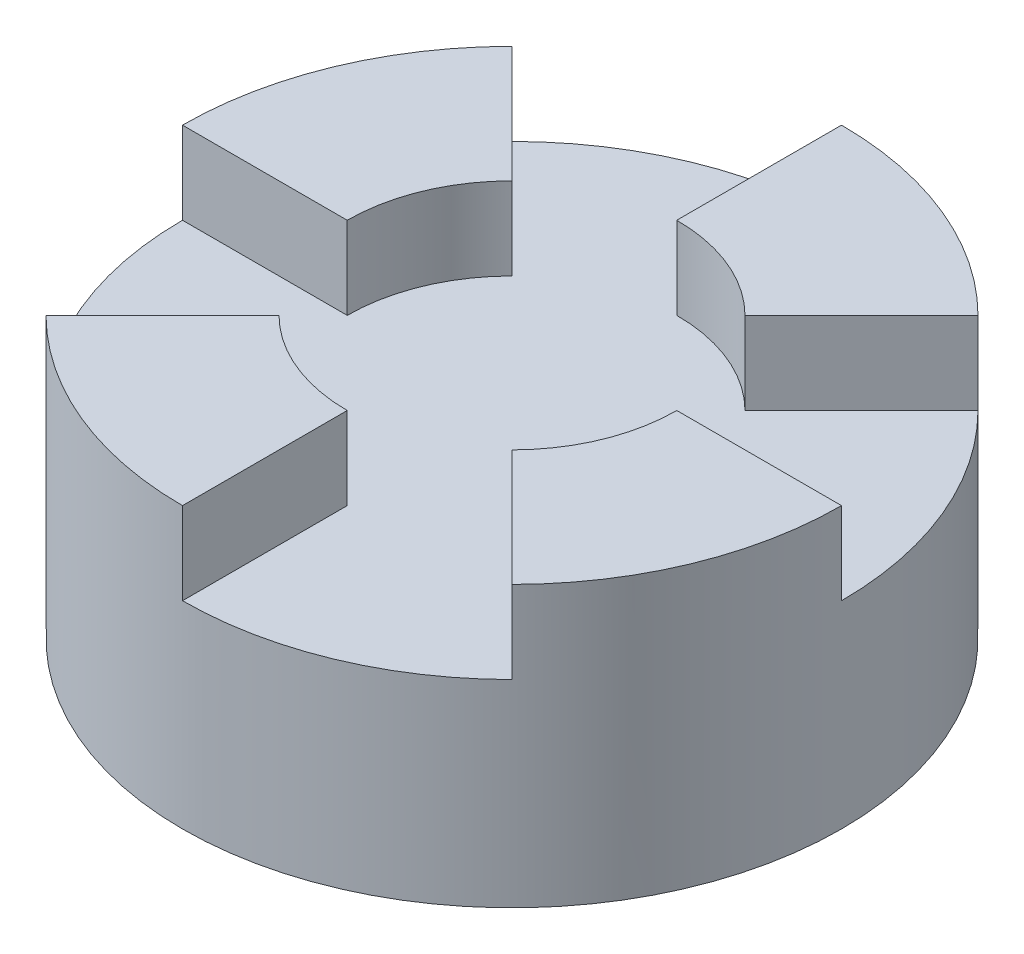
ISO-10303-21;
HEADER;
FILE_DESCRIPTION(('STEP AP214'),'2;1');
FILE_NAME('part.step','',(''),(''),'','','');
FILE_SCHEMA(('AUTOMOTIVE_DESIGN { 1 0 10303 214 1 1 1 1 }'));
ENDSEC;
DATA;
#1=APPLICATION_CONTEXT('core data for automotive mechanical design processes');
#2=APPLICATION_PROTOCOL_DEFINITION('international standard','automotive_design',2000,#1);
#3=PRODUCT_CONTEXT('',#1,'mechanical');
#4=PRODUCT('Part','Part','',(#3));
#5=PRODUCT_RELATED_PRODUCT_CATEGORY('part','',(#4));
#6=PRODUCT_DEFINITION_FORMATION('','',#4);
#7=PRODUCT_DEFINITION_CONTEXT('part definition',#1,'design');
#8=PRODUCT_DEFINITION('design','',#6,#7);
#9=PRODUCT_DEFINITION_SHAPE('','',#8);
#10=(LENGTH_UNIT() NAMED_UNIT(*) SI_UNIT(.MILLI.,.METRE.));
#11=(NAMED_UNIT(*) PLANE_ANGLE_UNIT() SI_UNIT($,.RADIAN.));
#12=(NAMED_UNIT(*) SI_UNIT($,.STERADIAN.) SOLID_ANGLE_UNIT());
#13=UNCERTAINTY_MEASURE_WITH_UNIT(LENGTH_MEASURE(1.E-05),#10,'distance_accuracy_value','');
#14=(GEOMETRIC_REPRESENTATION_CONTEXT(3) GLOBAL_UNCERTAINTY_ASSIGNED_CONTEXT((#13)) GLOBAL_UNIT_ASSIGNED_CONTEXT((#10,
#11,#12)) REPRESENTATION_CONTEXT('',''));
#15=CARTESIAN_POINT('',(0.,0.,0.));
#16=DIRECTION('',(0.,0.,1.));
#17=DIRECTION('',(1.,0.,0.));
#18=AXIS2_PLACEMENT_3D('',#15,#16,#17);
#19=CARTESIAN_POINT('',(0.,17.,0.));
#20=DIRECTION('',(0.,-1.,0.));
#21=DIRECTION('',(0.,0.,-1.));
#22=AXIS2_PLACEMENT_3D('',#19,#20,#21);
#23=CYLINDRICAL_SURFACE('',#22,20.);
#24=CARTESIAN_POINT('',(0.,0.,0.));
#25=DIRECTION('',(0.,1.,0.));
#26=DIRECTION('',(0.,0.,1.));
#27=AXIS2_PLACEMENT_3D('',#24,#25,#26);
#28=CIRCLE('',#27,20.);
#29=CARTESIAN_POINT('',(0.,0.,20.));
#30=VERTEX_POINT('',#29);
#31=EDGE_CURVE('E36',#30,#30,#28,.T.);
#32=ORIENTED_EDGE('',*,*,#31,.T.);
#33=EDGE_LOOP('',(#32));
#34=FACE_BOUND('',#33,.T.);
#35=DIRECTION('',(0.,1.,0.));
#36=VECTOR('',#35,1.);
#37=CARTESIAN_POINT('',(14.142135623731,12.,14.1421356237309));
#38=LINE('',#37,#36);
#39=CARTESIAN_POINT('',(14.142135623731,12.,14.1421356237309));
#40=VERTEX_POINT('',#39);
#41=CARTESIAN_POINT('',(14.142135623731,17.,14.1421356237309));
#42=VERTEX_POINT('',#41);
#43=EDGE_CURVE('E220',#40,#42,#38,.T.);
#44=ORIENTED_EDGE('',*,*,#43,.F.);
#45=CARTESIAN_POINT('',(0.,12.,0.));
#46=DIRECTION('',(0.,1.,0.));
#47=DIRECTION('',(0.,0.,1.));
#48=AXIS2_PLACEMENT_3D('',#45,#46,#47);
#49=CIRCLE('',#48,20.);
#50=CARTESIAN_POINT('',(0.,12.,20.));
#51=VERTEX_POINT('',#50);
#52=EDGE_CURVE('E432',#51,#40,#49,.T.);
#53=ORIENTED_EDGE('',*,*,#52,.F.);
#54=DIRECTION('',(0.,1.,0.));
#55=VECTOR('',#54,1.);
#56=CARTESIAN_POINT('',(0.,12.,20.));
#57=LINE('',#56,#55);
#58=CARTESIAN_POINT('',(0.,17.,20.));
#59=VERTEX_POINT('',#58);
#60=EDGE_CURVE('E222',#51,#59,#57,.T.);
#61=ORIENTED_EDGE('',*,*,#60,.T.);
#62=CARTESIAN_POINT('',(0.,17.,0.));
#63=DIRECTION('',(0.,1.,0.));
#64=DIRECTION('',(0.,0.,1.));
#65=AXIS2_PLACEMENT_3D('',#62,#63,#64);
#66=CIRCLE('',#65,20.);
#67=CARTESIAN_POINT('',(-14.1421356237309,17.,14.142135623731));
#68=VERTEX_POINT('',#67);
#69=EDGE_CURVE('E42',#68,#59,#66,.T.);
#70=ORIENTED_EDGE('',*,*,#69,.F.);
#71=DIRECTION('',(0.,1.,0.));
#72=VECTOR('',#71,1.);
#73=CARTESIAN_POINT('',(-14.1421356237309,12.,14.142135623731));
#74=LINE('',#73,#72);
#75=CARTESIAN_POINT('',(-14.1421356237309,12.,14.142135623731));
#76=VERTEX_POINT('',#75);
#77=EDGE_CURVE('E229',#76,#68,#74,.T.);
#78=ORIENTED_EDGE('',*,*,#77,.F.);
#79=CARTESIAN_POINT('',(0.,12.,0.));
#80=DIRECTION('',(0.,1.,0.));
#81=DIRECTION('',(0.,0.,1.));
#82=AXIS2_PLACEMENT_3D('',#79,#80,#81);
#83=CIRCLE('',#82,20.);
#84=CARTESIAN_POINT('',(-20.,12.,0.));
#85=VERTEX_POINT('',#84);
#86=EDGE_CURVE('E421',#85,#76,#83,.T.);
#87=ORIENTED_EDGE('',*,*,#86,.F.);
#88=DIRECTION('',(0.,1.,0.));
#89=VECTOR('',#88,1.);
#90=CARTESIAN_POINT('',(-20.,12.,0.));
#91=LINE('',#90,#89);
#92=CARTESIAN_POINT('',(-20.,17.,0.));
#93=VERTEX_POINT('',#92);
#94=EDGE_CURVE('E231',#85,#93,#91,.T.);
#95=ORIENTED_EDGE('',*,*,#94,.T.);
#96=CARTESIAN_POINT('',(-14.142135623731,17.,-14.1421356237309));
#97=VERTEX_POINT('',#96);
#98=EDGE_CURVE('E244',#97,#93,#66,.T.);
#99=ORIENTED_EDGE('',*,*,#98,.F.);
#100=DIRECTION('',(0.,1.,0.));
#101=VECTOR('',#100,1.);
#102=CARTESIAN_POINT('',(-14.142135623731,12.,-14.1421356237309));
#103=LINE('',#102,#101);
#104=CARTESIAN_POINT('',(-14.142135623731,12.,-14.1421356237309));
#105=VERTEX_POINT('',#104);
#106=EDGE_CURVE('E238',#105,#97,#103,.T.);
#107=ORIENTED_EDGE('',*,*,#106,.F.);
#108=CARTESIAN_POINT('',(0.,12.,0.));
#109=DIRECTION('',(0.,1.,0.));
#110=DIRECTION('',(0.,0.,1.));
#111=AXIS2_PLACEMENT_3D('',#108,#109,#110);
#112=CIRCLE('',#111,20.);
#113=CARTESIAN_POINT('',(0.,12.,-20.));
#114=VERTEX_POINT('',#113);
#115=EDGE_CURVE('E407',#114,#105,#112,.T.);
#116=ORIENTED_EDGE('',*,*,#115,.F.);
#117=DIRECTION('',(0.,1.,0.));
#118=VECTOR('',#117,1.);
#119=CARTESIAN_POINT('',(0.,12.,-20.));
#120=LINE('',#119,#118);
#121=CARTESIAN_POINT('',(0.,17.,-20.));
#122=VERTEX_POINT('',#121);
#123=EDGE_CURVE('E240',#114,#122,#120,.T.);
#124=ORIENTED_EDGE('',*,*,#123,.T.);
#125=CARTESIAN_POINT('',(14.1421356237309,17.,-14.142135623731));
#126=VERTEX_POINT('',#125);
#127=EDGE_CURVE('E41',#126,#122,#66,.T.);
#128=ORIENTED_EDGE('',*,*,#127,.F.);
#129=DIRECTION('',(0.,1.,0.));
#130=VECTOR('',#129,1.);
#131=CARTESIAN_POINT('',(14.1421356237309,12.,-14.142135623731));
#132=LINE('',#131,#130);
#133=CARTESIAN_POINT('',(14.1421356237309,12.,-14.142135623731));
#134=VERTEX_POINT('',#133);
#135=EDGE_CURVE('E162',#134,#126,#132,.T.);
#136=ORIENTED_EDGE('',*,*,#135,.F.);
#137=CARTESIAN_POINT('',(0.,12.,0.));
#138=DIRECTION('',(0.,1.,0.));
#139=DIRECTION('',(0.,0.,1.));
#140=AXIS2_PLACEMENT_3D('',#137,#138,#139);
#141=CIRCLE('',#140,20.);
#142=CARTESIAN_POINT('',(20.,12.,0.));
#143=VERTEX_POINT('',#142);
#144=EDGE_CURVE('E169',#143,#134,#141,.T.);
#145=ORIENTED_EDGE('',*,*,#144,.F.);
#146=DIRECTION('',(0.,1.,0.));
#147=VECTOR('',#146,1.);
#148=CARTESIAN_POINT('',(20.,12.,0.));
#149=LINE('',#148,#147);
#150=CARTESIAN_POINT('',(20.,17.,0.));
#151=VERTEX_POINT('',#150);
#152=EDGE_CURVE('E152',#143,#151,#149,.T.);
#153=ORIENTED_EDGE('',*,*,#152,.T.);
#154=EDGE_CURVE('E11',#42,#151,#66,.T.);
#155=ORIENTED_EDGE('',*,*,#154,.F.);
#156=EDGE_LOOP('',(#44,#53,#61,#70,#78,#87,#95,#99,#107,#116,#124,#128,#136,#145,#153,#155));
#157=FACE_BOUND('',#156,.T.);
#158=ADVANCED_FACE('F33',(#34,#157),#23,.T.);
#159=CARTESIAN_POINT('',(0.,17.,0.));
#160=DIRECTION('',(0.,1.,0.));
#161=DIRECTION('',(0.,0.,1.));
#162=AXIS2_PLACEMENT_3D('',#159,#160,#161);
#163=PLANE('',#162);
#164=DIRECTION('',(1.,0.,0.));
#165=VECTOR('',#164,1.);
#166=CARTESIAN_POINT('',(0.,17.,0.));
#167=LINE('',#166,#165);
#168=CARTESIAN_POINT('',(10.,17.,0.));
#169=VERTEX_POINT('',#168);
#170=EDGE_CURVE('E158',#169,#151,#167,.T.);
#171=ORIENTED_EDGE('',*,*,#170,.F.);
#172=CARTESIAN_POINT('',(0.,17.,0.));
#173=DIRECTION('',(0.,1.,0.));
#174=DIRECTION('',(0.,0.,1.));
#175=AXIS2_PLACEMENT_3D('',#172,#173,#174);
#176=CIRCLE('',#175,10.);
#177=CARTESIAN_POINT('',(7.07106781186549,17.,7.07106781186546));
#178=VERTEX_POINT('',#177);
#179=EDGE_CURVE('E207',#178,#169,#176,.T.);
#180=ORIENTED_EDGE('',*,*,#179,.F.);
#181=DIRECTION('',(0.707106781186549,0.,0.707106781186546));
#182=VECTOR('',#181,1.);
#183=CARTESIAN_POINT('',(0.,17.,0.));
#184=LINE('',#183,#182);
#185=EDGE_CURVE('E204',#178,#42,#184,.T.);
#186=ORIENTED_EDGE('',*,*,#185,.T.);
#187=ORIENTED_EDGE('',*,*,#154,.T.);
#188=EDGE_LOOP('',(#171,#180,#186,#187));
#189=FACE_BOUND('',#188,.T.);
#190=ADVANCED_FACE('F265',(#189),#163,.T.);
#191=ORIENTED_EDGE('',*,*,#98,.T.);
#192=DIRECTION('',(1.,0.,0.));
#193=VECTOR('',#192,1.);
#194=CARTESIAN_POINT('',(0.,17.,0.));
#195=LINE('',#194,#193);
#196=CARTESIAN_POINT('',(-10.,17.,0.));
#197=VERTEX_POINT('',#196);
#198=EDGE_CURVE('E193',#93,#197,#195,.T.);
#199=ORIENTED_EDGE('',*,*,#198,.T.);
#200=CARTESIAN_POINT('',(0.,17.,0.));
#201=DIRECTION('',(0.,1.,0.));
#202=DIRECTION('',(0.,0.,1.));
#203=AXIS2_PLACEMENT_3D('',#200,#201,#202);
#204=CIRCLE('',#203,10.);
#205=CARTESIAN_POINT('',(-7.07106781186549,17.,-7.07106781186546));
#206=VERTEX_POINT('',#205);
#207=EDGE_CURVE('E190',#206,#197,#204,.T.);
#208=ORIENTED_EDGE('',*,*,#207,.F.);
#209=DIRECTION('',(-0.707106781186549,0.,-0.707106781186546));
#210=VECTOR('',#209,1.);
#211=CARTESIAN_POINT('',(0.,17.,0.));
#212=LINE('',#211,#210);
#213=EDGE_CURVE('E187',#206,#97,#212,.T.);
#214=ORIENTED_EDGE('',*,*,#213,.T.);
#215=EDGE_LOOP('',(#191,#199,#208,#214));
#216=FACE_BOUND('',#215,.T.);
#217=ADVANCED_FACE('F270',(#216),#163,.T.);
#218=CARTESIAN_POINT('',(0.,17.,0.));
#219=DIRECTION('',(0.,1.,0.));
#220=DIRECTION('',(0.,0.,1.));
#221=AXIS2_PLACEMENT_3D('',#218,#219,#220);
#222=CIRCLE('',#221,10.);
#223=CARTESIAN_POINT('',(7.07106781186546,17.,-7.07106781186549));
#224=VERTEX_POINT('',#223);
#225=CARTESIAN_POINT('',(0.,17.,-10.));
#226=VERTEX_POINT('',#225);
#227=EDGE_CURVE('E49',#224,#226,#222,.T.);
#228=ORIENTED_EDGE('',*,*,#227,.F.);
#229=DIRECTION('',(0.707106781186546,0.,-0.707106781186549));
#230=VECTOR('',#229,1.);
#231=CARTESIAN_POINT('',(0.,17.,0.));
#232=LINE('',#231,#230);
#233=EDGE_CURVE('E211',#224,#126,#232,.T.);
#234=ORIENTED_EDGE('',*,*,#233,.T.);
#235=ORIENTED_EDGE('',*,*,#127,.T.);
#236=DIRECTION('',(0.,0.,1.));
#237=VECTOR('',#236,1.);
#238=CARTESIAN_POINT('',(0.,17.,0.));
#239=LINE('',#238,#237);
#240=EDGE_CURVE('E184',#122,#226,#239,.T.);
#241=ORIENTED_EDGE('',*,*,#240,.T.);
#242=EDGE_LOOP('',(#228,#234,#235,#241));
#243=FACE_BOUND('',#242,.T.);
#244=ADVANCED_FACE('F263',(#243),#163,.T.);
#245=DIRECTION('',(0.,0.,1.));
#246=VECTOR('',#245,1.);
#247=CARTESIAN_POINT('',(0.,17.,0.));
#248=LINE('',#247,#246);
#249=CARTESIAN_POINT('',(0.,17.,10.));
#250=VERTEX_POINT('',#249);
#251=EDGE_CURVE('E202',#250,#59,#248,.T.);
#252=ORIENTED_EDGE('',*,*,#251,.F.);
#253=CARTESIAN_POINT('',(0.,17.,0.));
#254=DIRECTION('',(0.,1.,0.));
#255=DIRECTION('',(0.,0.,1.));
#256=AXIS2_PLACEMENT_3D('',#253,#254,#255);
#257=CIRCLE('',#256,10.);
#258=CARTESIAN_POINT('',(-7.07106781186546,17.,7.07106781186549));
#259=VERTEX_POINT('',#258);
#260=EDGE_CURVE('E199',#259,#250,#257,.T.);
#261=ORIENTED_EDGE('',*,*,#260,.F.);
#262=DIRECTION('',(-0.707106781186546,0.,0.707106781186549));
#263=VECTOR('',#262,1.);
#264=CARTESIAN_POINT('',(0.,17.,0.));
#265=LINE('',#264,#263);
#266=EDGE_CURVE('E196',#259,#68,#265,.T.);
#267=ORIENTED_EDGE('',*,*,#266,.T.);
#268=ORIENTED_EDGE('',*,*,#69,.T.);
#269=EDGE_LOOP('',(#252,#261,#267,#268));
#270=FACE_BOUND('',#269,.T.);
#271=ADVANCED_FACE('F256',(#270),#163,.T.);
#272=CARTESIAN_POINT('',(0.,0.,0.));
#273=DIRECTION('',(0.,1.,0.));
#274=DIRECTION('',(0.,0.,1.));
#275=AXIS2_PLACEMENT_3D('',#272,#273,#274);
#276=PLANE('',#275);
#277=ORIENTED_EDGE('',*,*,#31,.F.);
#278=EDGE_LOOP('',(#277));
#279=FACE_BOUND('',#278,.T.);
#280=ADVANCED_FACE('F253',(#279),#276,.F.);
#281=CARTESIAN_POINT('',(0.,12.,0.));
#282=DIRECTION('',(0.,1.,0.));
#283=DIRECTION('',(0.,0.,1.));
#284=AXIS2_PLACEMENT_3D('',#281,#282,#283);
#285=CYLINDRICAL_SURFACE('',#284,10.);
#286=ORIENTED_EDGE('',*,*,#227,.T.);
#287=DIRECTION('',(0.,1.,0.));
#288=VECTOR('',#287,1.);
#289=CARTESIAN_POINT('',(0.,12.,-10.));
#290=LINE('',#289,#288);
#291=CARTESIAN_POINT('',(0.,12.,-10.));
#292=VERTEX_POINT('',#291);
#293=EDGE_CURVE('E179',#292,#226,#290,.T.);
#294=ORIENTED_EDGE('',*,*,#293,.F.);
#295=CARTESIAN_POINT('',(0.,12.,0.));
#296=DIRECTION('',(0.,1.,0.));
#297=DIRECTION('',(0.,0.,1.));
#298=AXIS2_PLACEMENT_3D('',#295,#296,#297);
#299=CIRCLE('',#298,10.);
#300=CARTESIAN_POINT('',(7.07106781186546,12.,-7.07106781186549));
#301=VERTEX_POINT('',#300);
#302=EDGE_CURVE('E214',#301,#292,#299,.T.);
#303=ORIENTED_EDGE('',*,*,#302,.F.);
#304=DIRECTION('',(0.,1.,0.));
#305=VECTOR('',#304,1.);
#306=CARTESIAN_POINT('',(7.07106781186546,12.,-7.07106781186549));
#307=LINE('',#306,#305);
#308=EDGE_CURVE('E57',#301,#224,#307,.T.);
#309=ORIENTED_EDGE('',*,*,#308,.T.);
#310=EDGE_LOOP('',(#286,#294,#303,#309));
#311=FACE_BOUND('',#310,.T.);
#312=ADVANCED_FACE('F255',(#311),#285,.F.);
#313=CARTESIAN_POINT('',(0.,12.,0.));
#314=DIRECTION('',(0.707106781186549,0.,0.707106781186546));
#315=DIRECTION('',(0.707106781186546,0.,-0.707106781186549));
#316=AXIS2_PLACEMENT_3D('',#313,#314,#315);
#317=PLANE('',#316);
#318=ORIENTED_EDGE('',*,*,#233,.F.);
#319=ORIENTED_EDGE('',*,*,#308,.F.);
#320=DIRECTION('',(0.707106781186546,0.,-0.707106781186549));
#321=VECTOR('',#320,1.);
#322=CARTESIAN_POINT('',(0.,12.,0.));
#323=LINE('',#322,#321);
#324=EDGE_CURVE('E177',#301,#134,#323,.T.);
#325=ORIENTED_EDGE('',*,*,#324,.T.);
#326=ORIENTED_EDGE('',*,*,#135,.T.);
#327=EDGE_LOOP('',(#318,#319,#325,#326));
#328=FACE_BOUND('',#327,.T.);
#329=ADVANCED_FACE('F261',(#328),#317,.T.);
#330=CARTESIAN_POINT('',(0.,12.,0.));
#331=DIRECTION('',(0.,0.,1.));
#332=DIRECTION('',(1.,0.,0.));
#333=AXIS2_PLACEMENT_3D('',#330,#331,#332);
#334=PLANE('',#333);
#335=ORIENTED_EDGE('',*,*,#170,.T.);
#336=ORIENTED_EDGE('',*,*,#152,.F.);
#337=DIRECTION('',(1.,0.,0.));
#338=VECTOR('',#337,1.);
#339=CARTESIAN_POINT('',(0.,12.,0.));
#340=LINE('',#339,#338);
#341=CARTESIAN_POINT('',(10.,12.,0.));
#342=VERTEX_POINT('',#341);
#343=EDGE_CURVE('E155',#342,#143,#340,.T.);
#344=ORIENTED_EDGE('',*,*,#343,.F.);
#345=DIRECTION('',(0.,1.,0.));
#346=VECTOR('',#345,1.);
#347=CARTESIAN_POINT('',(10.,12.,0.));
#348=LINE('',#347,#346);
#349=EDGE_CURVE('E163',#342,#169,#348,.T.);
#350=ORIENTED_EDGE('',*,*,#349,.T.);
#351=EDGE_LOOP('',(#335,#336,#344,#350));
#352=FACE_BOUND('',#351,.T.);
#353=ADVANCED_FACE('F154',(#352),#334,.F.);
#354=CARTESIAN_POINT('',(0.,12.,0.));
#355=DIRECTION('',(0.,1.,0.));
#356=DIRECTION('',(0.,0.,1.));
#357=AXIS2_PLACEMENT_3D('',#354,#355,#356);
#358=CYLINDRICAL_SURFACE('',#357,10.);
#359=ORIENTED_EDGE('',*,*,#179,.T.);
#360=ORIENTED_EDGE('',*,*,#349,.F.);
#361=CARTESIAN_POINT('',(0.,12.,0.));
#362=DIRECTION('',(0.,1.,0.));
#363=DIRECTION('',(0.,0.,1.));
#364=AXIS2_PLACEMENT_3D('',#361,#362,#363);
#365=CIRCLE('',#364,10.);
#366=CARTESIAN_POINT('',(7.07106781186549,12.,7.07106781186546));
#367=VERTEX_POINT('',#366);
#368=EDGE_CURVE('E173',#367,#342,#365,.T.);
#369=ORIENTED_EDGE('',*,*,#368,.F.);
#370=DIRECTION('',(0.,1.,0.));
#371=VECTOR('',#370,1.);
#372=CARTESIAN_POINT('',(7.07106781186549,12.,7.07106781186546));
#373=LINE('',#372,#371);
#374=EDGE_CURVE('E218',#367,#178,#373,.T.);
#375=ORIENTED_EDGE('',*,*,#374,.T.);
#376=EDGE_LOOP('',(#359,#360,#369,#375));
#377=FACE_BOUND('',#376,.T.);
#378=ADVANCED_FACE('F307',(#377),#358,.F.);
#379=CARTESIAN_POINT('',(0.,12.,0.));
#380=DIRECTION('',(-0.707106781186546,0.,0.707106781186549));
#381=DIRECTION('',(0.707106781186549,0.,0.707106781186546));
#382=AXIS2_PLACEMENT_3D('',#379,#380,#381);
#383=PLANE('',#382);
#384=ORIENTED_EDGE('',*,*,#185,.F.);
#385=ORIENTED_EDGE('',*,*,#374,.F.);
#386=DIRECTION('',(0.707106781186549,0.,0.707106781186546));
#387=VECTOR('',#386,1.);
#388=CARTESIAN_POINT('',(0.,12.,0.));
#389=LINE('',#388,#387);
#390=EDGE_CURVE('E435',#367,#40,#389,.T.);
#391=ORIENTED_EDGE('',*,*,#390,.T.);
#392=ORIENTED_EDGE('',*,*,#43,.T.);
#393=EDGE_LOOP('',(#384,#385,#391,#392));
#394=FACE_BOUND('',#393,.T.);
#395=ADVANCED_FACE('F303',(#394),#383,.T.);
#396=CARTESIAN_POINT('',(0.,12.,0.));
#397=DIRECTION('',(-1.,0.,0.));
#398=DIRECTION('',(0.,0.,1.));
#399=AXIS2_PLACEMENT_3D('',#396,#397,#398);
#400=PLANE('',#399);
#401=ORIENTED_EDGE('',*,*,#251,.T.);
#402=ORIENTED_EDGE('',*,*,#60,.F.);
#403=DIRECTION('',(0.,0.,1.));
#404=VECTOR('',#403,1.);
#405=CARTESIAN_POINT('',(0.,12.,0.));
#406=LINE('',#405,#404);
#407=CARTESIAN_POINT('',(0.,12.,10.));
#408=VERTEX_POINT('',#407);
#409=EDGE_CURVE('E429',#408,#51,#406,.T.);
#410=ORIENTED_EDGE('',*,*,#409,.F.);
#411=DIRECTION('',(0.,1.,0.));
#412=VECTOR('',#411,1.);
#413=CARTESIAN_POINT('',(0.,12.,10.));
#414=LINE('',#413,#412);
#415=EDGE_CURVE('E225',#408,#250,#414,.T.);
#416=ORIENTED_EDGE('',*,*,#415,.T.);
#417=EDGE_LOOP('',(#401,#402,#410,#416));
#418=FACE_BOUND('',#417,.T.);
#419=ADVANCED_FACE('F299',(#418),#400,.F.);
#420=CARTESIAN_POINT('',(0.,12.,0.));
#421=DIRECTION('',(0.,1.,0.));
#422=DIRECTION('',(0.,0.,1.));
#423=AXIS2_PLACEMENT_3D('',#420,#421,#422);
#424=CYLINDRICAL_SURFACE('',#423,10.);
#425=ORIENTED_EDGE('',*,*,#260,.T.);
#426=ORIENTED_EDGE('',*,*,#415,.F.);
#427=CARTESIAN_POINT('',(0.,12.,0.));
#428=DIRECTION('',(0.,1.,0.));
#429=DIRECTION('',(0.,0.,1.));
#430=AXIS2_PLACEMENT_3D('',#427,#428,#429);
#431=CIRCLE('',#430,10.);
#432=CARTESIAN_POINT('',(-7.07106781186546,12.,7.07106781186549));
#433=VERTEX_POINT('',#432);
#434=EDGE_CURVE('E426',#433,#408,#431,.T.);
#435=ORIENTED_EDGE('',*,*,#434,.F.);
#436=DIRECTION('',(0.,1.,0.));
#437=VECTOR('',#436,1.);
#438=CARTESIAN_POINT('',(-7.07106781186546,12.,7.07106781186549));
#439=LINE('',#438,#437);
#440=EDGE_CURVE('E227',#433,#259,#439,.T.);
#441=ORIENTED_EDGE('',*,*,#440,.T.);
#442=EDGE_LOOP('',(#425,#426,#435,#441));
#443=FACE_BOUND('',#442,.T.);
#444=ADVANCED_FACE('F295',(#443),#424,.F.);
#445=CARTESIAN_POINT('',(0.,12.,0.));
#446=DIRECTION('',(-0.707106781186549,0.,-0.707106781186546));
#447=DIRECTION('',(-0.707106781186546,0.,0.707106781186549));
#448=AXIS2_PLACEMENT_3D('',#445,#446,#447);
#449=PLANE('',#448);
#450=ORIENTED_EDGE('',*,*,#266,.F.);
#451=ORIENTED_EDGE('',*,*,#440,.F.);
#452=DIRECTION('',(-0.707106781186546,0.,0.707106781186549));
#453=VECTOR('',#452,1.);
#454=CARTESIAN_POINT('',(0.,12.,0.));
#455=LINE('',#454,#453);
#456=EDGE_CURVE('E424',#433,#76,#455,.T.);
#457=ORIENTED_EDGE('',*,*,#456,.T.);
#458=ORIENTED_EDGE('',*,*,#77,.T.);
#459=EDGE_LOOP('',(#450,#451,#457,#458));
#460=FACE_BOUND('',#459,.T.);
#461=ADVANCED_FACE('F291',(#460),#449,.T.);
#462=CARTESIAN_POINT('',(0.,12.,0.));
#463=DIRECTION('',(0.,0.,1.));
#464=DIRECTION('',(1.,0.,0.));
#465=AXIS2_PLACEMENT_3D('',#462,#463,#464);
#466=PLANE('',#465);
#467=ORIENTED_EDGE('',*,*,#198,.F.);
#468=ORIENTED_EDGE('',*,*,#94,.F.);
#469=DIRECTION('',(1.,0.,0.));
#470=VECTOR('',#469,1.);
#471=CARTESIAN_POINT('',(0.,12.,0.));
#472=LINE('',#471,#470);
#473=CARTESIAN_POINT('',(-10.,12.,0.));
#474=VERTEX_POINT('',#473);
#475=EDGE_CURVE('E419',#85,#474,#472,.T.);
#476=ORIENTED_EDGE('',*,*,#475,.T.);
#477=DIRECTION('',(0.,1.,0.));
#478=VECTOR('',#477,1.);
#479=CARTESIAN_POINT('',(-10.,12.,0.));
#480=LINE('',#479,#478);
#481=EDGE_CURVE('E234',#474,#197,#480,.T.);
#482=ORIENTED_EDGE('',*,*,#481,.T.);
#483=EDGE_LOOP('',(#467,#468,#476,#482));
#484=FACE_BOUND('',#483,.T.);
#485=ADVANCED_FACE('F287',(#484),#466,.T.);
#486=CARTESIAN_POINT('',(0.,12.,0.));
#487=DIRECTION('',(0.,1.,0.));
#488=DIRECTION('',(0.,0.,1.));
#489=AXIS2_PLACEMENT_3D('',#486,#487,#488);
#490=CYLINDRICAL_SURFACE('',#489,10.);
#491=ORIENTED_EDGE('',*,*,#207,.T.);
#492=ORIENTED_EDGE('',*,*,#481,.F.);
#493=CARTESIAN_POINT('',(0.,12.,0.));
#494=DIRECTION('',(0.,1.,0.));
#495=DIRECTION('',(0.,0.,1.));
#496=AXIS2_PLACEMENT_3D('',#493,#494,#495);
#497=CIRCLE('',#496,10.);
#498=CARTESIAN_POINT('',(-7.07106781186549,12.,-7.07106781186546));
#499=VERTEX_POINT('',#498);
#500=EDGE_CURVE('E412',#499,#474,#497,.T.);
#501=ORIENTED_EDGE('',*,*,#500,.F.);
#502=DIRECTION('',(0.,1.,0.));
#503=VECTOR('',#502,1.);
#504=CARTESIAN_POINT('',(-7.07106781186549,12.,-7.07106781186546));
#505=LINE('',#504,#503);
#506=EDGE_CURVE('E236',#499,#206,#505,.T.);
#507=ORIENTED_EDGE('',*,*,#506,.T.);
#508=EDGE_LOOP('',(#491,#492,#501,#507));
#509=FACE_BOUND('',#508,.T.);
#510=ADVANCED_FACE('F283',(#509),#490,.F.);
#511=CARTESIAN_POINT('',(0.,12.,0.));
#512=DIRECTION('',(0.707106781186546,0.,-0.707106781186549));
#513=DIRECTION('',(-0.707106781186549,0.,-0.707106781186546));
#514=AXIS2_PLACEMENT_3D('',#511,#512,#513);
#515=PLANE('',#514);
#516=ORIENTED_EDGE('',*,*,#213,.F.);
#517=ORIENTED_EDGE('',*,*,#506,.F.);
#518=DIRECTION('',(-0.707106781186549,0.,-0.707106781186546));
#519=VECTOR('',#518,1.);
#520=CARTESIAN_POINT('',(0.,12.,0.));
#521=LINE('',#520,#519);
#522=EDGE_CURVE('E410',#499,#105,#521,.T.);
#523=ORIENTED_EDGE('',*,*,#522,.T.);
#524=ORIENTED_EDGE('',*,*,#106,.T.);
#525=EDGE_LOOP('',(#516,#517,#523,#524));
#526=FACE_BOUND('',#525,.T.);
#527=ADVANCED_FACE('F280',(#526),#515,.T.);
#528=CARTESIAN_POINT('',(0.,12.,0.));
#529=DIRECTION('',(-1.,0.,0.));
#530=DIRECTION('',(0.,0.,1.));
#531=AXIS2_PLACEMENT_3D('',#528,#529,#530);
#532=PLANE('',#531);
#533=ORIENTED_EDGE('',*,*,#240,.F.);
#534=ORIENTED_EDGE('',*,*,#123,.F.);
#535=DIRECTION('',(0.,0.,1.));
#536=VECTOR('',#535,1.);
#537=CARTESIAN_POINT('',(0.,12.,0.));
#538=LINE('',#537,#536);
#539=EDGE_CURVE('E113',#114,#292,#538,.T.);
#540=ORIENTED_EDGE('',*,*,#539,.T.);
#541=ORIENTED_EDGE('',*,*,#293,.T.);
#542=EDGE_LOOP('',(#533,#534,#540,#541));
#543=FACE_BOUND('',#542,.T.);
#544=ADVANCED_FACE('F277',(#543),#532,.T.);
#545=CARTESIAN_POINT('',(0.,12.,0.));
#546=DIRECTION('',(0.,1.,0.));
#547=DIRECTION('',(0.,0.,1.));
#548=AXIS2_PLACEMENT_3D('',#545,#546,#547);
#549=PLANE('',#548);
#550=ORIENTED_EDGE('',*,*,#302,.T.);
#551=ORIENTED_EDGE('',*,*,#539,.F.);
#552=ORIENTED_EDGE('',*,*,#115,.T.);
#553=ORIENTED_EDGE('',*,*,#522,.F.);
#554=ORIENTED_EDGE('',*,*,#500,.T.);
#555=ORIENTED_EDGE('',*,*,#475,.F.);
#556=ORIENTED_EDGE('',*,*,#86,.T.);
#557=ORIENTED_EDGE('',*,*,#456,.F.);
#558=ORIENTED_EDGE('',*,*,#434,.T.);
#559=ORIENTED_EDGE('',*,*,#409,.T.);
#560=ORIENTED_EDGE('',*,*,#52,.T.);
#561=ORIENTED_EDGE('',*,*,#390,.F.);
#562=ORIENTED_EDGE('',*,*,#368,.T.);
#563=ORIENTED_EDGE('',*,*,#343,.T.);
#564=ORIENTED_EDGE('',*,*,#144,.T.);
#565=ORIENTED_EDGE('',*,*,#324,.F.);
#566=EDGE_LOOP('',(#550,#551,#552,#553,#554,#555,#556,#557,#558,#559,#560,#561,#562,#563,#564,#565));
#567=FACE_BOUND('',#566,.T.);
#568=ADVANCED_FACE('F168',(#567),#549,.T.);
#569=CLOSED_SHELL('',(#158,#190,#217,#244,#271,#280,#312,#329,#353,#378,#395,#419,#444,#461,
#485,#510,#527,#544,#568));
#570=MANIFOLD_SOLID_BREP('B2',#569);
#571=ADVANCED_BREP_SHAPE_REPRESENTATION('',(#18,#570),#14);
#572=SHAPE_DEFINITION_REPRESENTATION(#9,#571);
ENDSEC;
END-ISO-10303-21;
